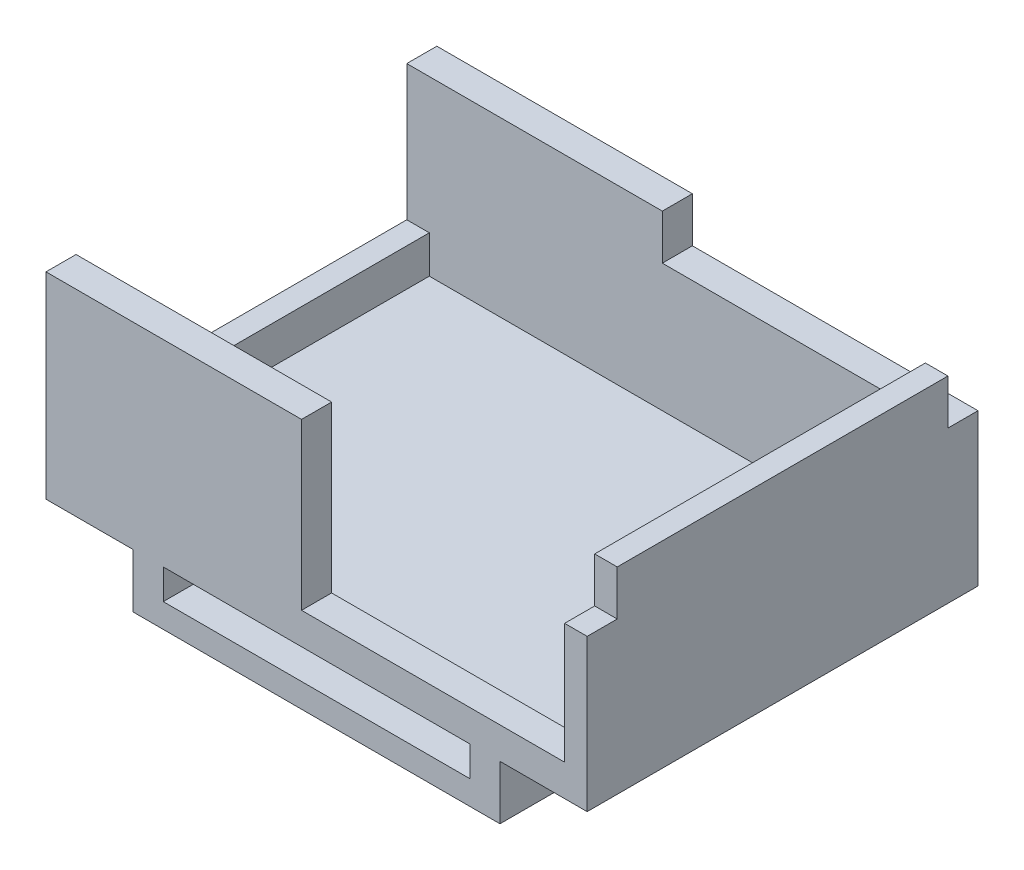
ISO-10303-21;
HEADER;
FILE_DESCRIPTION(('STEP AP214'),'2;1');
FILE_NAME('part.step','',(''),(''),'','','');
FILE_SCHEMA(('AUTOMOTIVE_DESIGN { 1 0 10303 214 1 1 1 1 }'));
ENDSEC;
DATA;
#1=APPLICATION_CONTEXT('core data for automotive mechanical design processes');
#2=APPLICATION_PROTOCOL_DEFINITION('international standard','automotive_design',2000,#1);
#3=PRODUCT_CONTEXT('',#1,'mechanical');
#4=PRODUCT('Part','Part','',(#3));
#5=PRODUCT_RELATED_PRODUCT_CATEGORY('part','',(#4));
#6=PRODUCT_DEFINITION_FORMATION('','',#4);
#7=PRODUCT_DEFINITION_CONTEXT('part definition',#1,'design');
#8=PRODUCT_DEFINITION('design','',#6,#7);
#9=PRODUCT_DEFINITION_SHAPE('','',#8);
#10=(LENGTH_UNIT() NAMED_UNIT(*) SI_UNIT(.MILLI.,.METRE.));
#11=(NAMED_UNIT(*) PLANE_ANGLE_UNIT() SI_UNIT($,.RADIAN.));
#12=(NAMED_UNIT(*) SI_UNIT($,.STERADIAN.) SOLID_ANGLE_UNIT());
#13=UNCERTAINTY_MEASURE_WITH_UNIT(LENGTH_MEASURE(1.E-05),#10,'distance_accuracy_value','');
#14=(GEOMETRIC_REPRESENTATION_CONTEXT(3) GLOBAL_UNCERTAINTY_ASSIGNED_CONTEXT((#13)) GLOBAL_UNIT_ASSIGNED_CONTEXT((#10,
#11,#12)) REPRESENTATION_CONTEXT('',''));
#15=CARTESIAN_POINT('',(0.,0.,0.));
#16=DIRECTION('',(0.,0.,1.));
#17=DIRECTION('',(1.,0.,0.));
#18=AXIS2_PLACEMENT_3D('',#15,#16,#17);
#19=CARTESIAN_POINT('',(0.,10.1,0.));
#20=DIRECTION('',(0.,1.,0.));
#21=DIRECTION('',(0.,0.,1.));
#22=AXIS2_PLACEMENT_3D('',#19,#20,#21);
#23=PLANE('',#22);
#24=DIRECTION('',(0.,0.,-1.));
#25=VECTOR('',#24,1.);
#26=CARTESIAN_POINT('',(16.5,10.1,13.));
#27=LINE('',#26,#25);
#28=CARTESIAN_POINT('',(16.5,10.1,13.));
#29=VERTEX_POINT('',#28);
#30=CARTESIAN_POINT('',(16.5,10.1,11.));
#31=VERTEX_POINT('',#30);
#32=EDGE_CURVE('E284',#29,#31,#27,.T.);
#33=ORIENTED_EDGE('',*,*,#32,.F.);
#34=DIRECTION('',(1.,0.,0.));
#35=VECTOR('',#34,1.);
#36=CARTESIAN_POINT('',(-18.,10.1,13.));
#37=LINE('',#36,#35);
#38=CARTESIAN_POINT('',(18.,10.1,13.));
#39=VERTEX_POINT('',#38);
#40=EDGE_CURVE('E482',#29,#39,#37,.T.);
#41=ORIENTED_EDGE('',*,*,#40,.T.);
#42=DIRECTION('',(0.,0.,-1.));
#43=VECTOR('',#42,1.);
#44=CARTESIAN_POINT('',(18.,10.1,-13.));
#45=LINE('',#44,#43);
#46=CARTESIAN_POINT('',(18.,10.1,11.));
#47=VERTEX_POINT('',#46);
#48=EDGE_CURVE('E61',#39,#47,#45,.T.);
#49=ORIENTED_EDGE('',*,*,#48,.T.);
#50=DIRECTION('',(1.,0.,0.));
#51=VECTOR('',#50,1.);
#52=CARTESIAN_POINT('',(16.5,10.1,11.));
#53=LINE('',#52,#51);
#54=EDGE_CURVE('E297',#31,#47,#53,.T.);
#55=ORIENTED_EDGE('',*,*,#54,.F.);
#56=EDGE_LOOP('',(#33,#41,#49,#55));
#57=FACE_BOUND('',#56,.T.);
#58=ADVANCED_FACE('F39',(#57),#23,.T.);
#59=DIRECTION('',(1.,0.,0.));
#60=VECTOR('',#59,1.);
#61=CARTESIAN_POINT('',(-16.5,10.1,-11.));
#62=LINE('',#61,#60);
#63=CARTESIAN_POINT('',(-0.999999999999997,10.1,-11.));
#64=VERTEX_POINT('',#63);
#65=CARTESIAN_POINT('',(16.5,10.1,-11.));
#66=VERTEX_POINT('',#65);
#67=EDGE_CURVE('E11',#64,#66,#62,.T.);
#68=ORIENTED_EDGE('',*,*,#67,.T.);
#69=DIRECTION('',(-1.,0.,0.));
#70=VECTOR('',#69,1.);
#71=CARTESIAN_POINT('',(16.5,10.1,-11.));
#72=LINE('',#71,#70);
#73=CARTESIAN_POINT('',(18.,10.1,-11.));
#74=VERTEX_POINT('',#73);
#75=EDGE_CURVE('E53',#74,#66,#72,.T.);
#76=ORIENTED_EDGE('',*,*,#75,.F.);
#77=CARTESIAN_POINT('',(18.,10.1,-13.));
#78=VERTEX_POINT('',#77);
#79=EDGE_CURVE('E485',#74,#78,#45,.T.);
#80=ORIENTED_EDGE('',*,*,#79,.T.);
#81=DIRECTION('',(-1.,0.,0.));
#82=VECTOR('',#81,1.);
#83=CARTESIAN_POINT('',(-18.,10.1,-13.));
#84=LINE('',#83,#82);
#85=CARTESIAN_POINT('',(-0.999999999999997,10.1,-13.));
#86=VERTEX_POINT('',#85);
#87=EDGE_CURVE('E487',#78,#86,#84,.T.);
#88=ORIENTED_EDGE('',*,*,#87,.T.);
#89=DIRECTION('',(0.,0.,-1.));
#90=VECTOR('',#89,1.);
#91=CARTESIAN_POINT('',(-0.999999999999997,10.1,-13.));
#92=LINE('',#91,#90);
#93=EDGE_CURVE('E274',#64,#86,#92,.T.);
#94=ORIENTED_EDGE('',*,*,#93,.F.);
#95=EDGE_LOOP('',(#68,#76,#80,#88,#94));
#96=FACE_BOUND('',#95,.T.);
#97=ADVANCED_FACE('F592',(#96),#23,.T.);
#98=CARTESIAN_POINT('',(0.,0.,0.));
#99=DIRECTION('',(0.,1.,0.));
#100=DIRECTION('',(0.,0.,1.));
#101=AXIS2_PLACEMENT_3D('',#98,#99,#100);
#102=PLANE('',#101);
#103=DIRECTION('',(0.,0.,1.));
#104=VECTOR('',#103,1.);
#105=CARTESIAN_POINT('',(-10.2,0.,-13.));
#106=LINE('',#105,#104);
#107=CARTESIAN_POINT('',(-10.2,0.,-13.));
#108=VERTEX_POINT('',#107);
#109=CARTESIAN_POINT('',(-10.2,0.,-9.));
#110=VERTEX_POINT('',#109);
#111=EDGE_CURVE('E381',#108,#110,#106,.T.);
#112=ORIENTED_EDGE('',*,*,#111,.F.);
#113=DIRECTION('',(-1.,0.,0.));
#114=VECTOR('',#113,1.);
#115=CARTESIAN_POINT('',(-18.,0.,-13.));
#116=LINE('',#115,#114);
#117=CARTESIAN_POINT('',(10.2,0.,-13.));
#118=VERTEX_POINT('',#117);
#119=EDGE_CURVE('E521',#118,#108,#116,.T.);
#120=ORIENTED_EDGE('',*,*,#119,.F.);
#121=DIRECTION('',(0.,0.,-1.));
#122=VECTOR('',#121,1.);
#123=CARTESIAN_POINT('',(10.2,0.,-13.));
#124=LINE('',#123,#122);
#125=CARTESIAN_POINT('',(10.2,0.,-8.99999999999999));
#126=VERTEX_POINT('',#125);
#127=EDGE_CURVE('E410',#126,#118,#124,.T.);
#128=ORIENTED_EDGE('',*,*,#127,.F.);
#129=DIRECTION('',(-1.,0.,0.));
#130=VECTOR('',#129,1.);
#131=CARTESIAN_POINT('',(10.2,0.,-8.99999999999999));
#132=LINE('',#131,#130);
#133=CARTESIAN_POINT('',(12.2,0.,-8.99999999999999));
#134=VERTEX_POINT('',#133);
#135=EDGE_CURVE('E412',#134,#126,#132,.T.);
#136=ORIENTED_EDGE('',*,*,#135,.F.);
#137=DIRECTION('',(0.,0.,1.));
#138=VECTOR('',#137,1.);
#139=CARTESIAN_POINT('',(12.2,0.,-13.));
#140=LINE('',#139,#138);
#141=CARTESIAN_POINT('',(12.2,0.,-13.));
#142=VERTEX_POINT('',#141);
#143=EDGE_CURVE('E405',#142,#134,#140,.T.);
#144=ORIENTED_EDGE('',*,*,#143,.F.);
#145=CARTESIAN_POINT('',(18.,0.,-13.));
#146=VERTEX_POINT('',#145);
#147=EDGE_CURVE('E517',#146,#142,#116,.T.);
#148=ORIENTED_EDGE('',*,*,#147,.F.);
#149=DIRECTION('',(0.,0.,-1.));
#150=VECTOR('',#149,1.);
#151=CARTESIAN_POINT('',(18.,0.,-13.));
#152=LINE('',#151,#150);
#153=CARTESIAN_POINT('',(18.,0.,13.));
#154=VERTEX_POINT('',#153);
#155=EDGE_CURVE('E505',#154,#146,#152,.T.);
#156=ORIENTED_EDGE('',*,*,#155,.F.);
#157=DIRECTION('',(1.,0.,0.));
#158=VECTOR('',#157,1.);
#159=CARTESIAN_POINT('',(-18.,0.,13.));
#160=LINE('',#159,#158);
#161=CARTESIAN_POINT('',(12.2,0.,13.));
#162=VERTEX_POINT('',#161);
#163=EDGE_CURVE('E524',#162,#154,#160,.T.);
#164=ORIENTED_EDGE('',*,*,#163,.F.);
#165=DIRECTION('',(0.,0.,1.));
#166=VECTOR('',#165,1.);
#167=CARTESIAN_POINT('',(12.2,0.,13.));
#168=LINE('',#167,#166);
#169=CARTESIAN_POINT('',(12.2,0.,8.99999999999999));
#170=VERTEX_POINT('',#169);
#171=EDGE_CURVE('E430',#170,#162,#168,.T.);
#172=ORIENTED_EDGE('',*,*,#171,.F.);
#173=DIRECTION('',(1.,0.,0.));
#174=VECTOR('',#173,1.);
#175=CARTESIAN_POINT('',(10.2,0.,8.99999999999999));
#176=LINE('',#175,#174);
#177=CARTESIAN_POINT('',(10.2,0.,8.99999999999999));
#178=VERTEX_POINT('',#177);
#179=EDGE_CURVE('E433',#178,#170,#176,.T.);
#180=ORIENTED_EDGE('',*,*,#179,.F.);
#181=DIRECTION('',(0.,0.,-1.));
#182=VECTOR('',#181,1.);
#183=CARTESIAN_POINT('',(10.2,0.,13.));
#184=LINE('',#183,#182);
#185=CARTESIAN_POINT('',(10.2,0.,13.));
#186=VERTEX_POINT('',#185);
#187=EDGE_CURVE('E425',#186,#178,#184,.T.);
#188=ORIENTED_EDGE('',*,*,#187,.F.);
#189=CARTESIAN_POINT('',(-10.2,0.,13.));
#190=VERTEX_POINT('',#189);
#191=EDGE_CURVE('E529',#190,#186,#160,.T.);
#192=ORIENTED_EDGE('',*,*,#191,.F.);
#193=DIRECTION('',(0.,0.,1.));
#194=VECTOR('',#193,1.);
#195=CARTESIAN_POINT('',(-10.2,0.,13.));
#196=LINE('',#195,#194);
#197=CARTESIAN_POINT('',(-10.2,0.,9.));
#198=VERTEX_POINT('',#197);
#199=EDGE_CURVE('E450',#198,#190,#196,.T.);
#200=ORIENTED_EDGE('',*,*,#199,.F.);
#201=DIRECTION('',(1.,0.,0.));
#202=VECTOR('',#201,1.);
#203=CARTESIAN_POINT('',(-10.2,0.,9.));
#204=LINE('',#203,#202);
#205=CARTESIAN_POINT('',(-12.2,0.,9.));
#206=VERTEX_POINT('',#205);
#207=EDGE_CURVE('E453',#206,#198,#204,.T.);
#208=ORIENTED_EDGE('',*,*,#207,.F.);
#209=DIRECTION('',(0.,0.,-1.));
#210=VECTOR('',#209,1.);
#211=CARTESIAN_POINT('',(-12.2,0.,13.));
#212=LINE('',#211,#210);
#213=CARTESIAN_POINT('',(-12.2,0.,13.));
#214=VERTEX_POINT('',#213);
#215=EDGE_CURVE('E445',#214,#206,#212,.T.);
#216=ORIENTED_EDGE('',*,*,#215,.F.);
#217=CARTESIAN_POINT('',(-18.,0.,13.));
#218=VERTEX_POINT('',#217);
#219=EDGE_CURVE('E525',#218,#214,#160,.T.);
#220=ORIENTED_EDGE('',*,*,#219,.F.);
#221=DIRECTION('',(0.,0.,1.));
#222=VECTOR('',#221,1.);
#223=CARTESIAN_POINT('',(-18.,0.,-13.));
#224=LINE('',#223,#222);
#225=CARTESIAN_POINT('',(-18.,0.,-13.));
#226=VERTEX_POINT('',#225);
#227=EDGE_CURVE('E520',#226,#218,#224,.T.);
#228=ORIENTED_EDGE('',*,*,#227,.F.);
#229=CARTESIAN_POINT('',(-12.2,0.,-13.));
#230=VERTEX_POINT('',#229);
#231=EDGE_CURVE('E516',#230,#226,#116,.T.);
#232=ORIENTED_EDGE('',*,*,#231,.F.);
#233=DIRECTION('',(0.,0.,-1.));
#234=VECTOR('',#233,1.);
#235=CARTESIAN_POINT('',(-12.2,0.,-13.));
#236=LINE('',#235,#234);
#237=CARTESIAN_POINT('',(-12.2,0.,-9.));
#238=VERTEX_POINT('',#237);
#239=EDGE_CURVE('E390',#238,#230,#236,.T.);
#240=ORIENTED_EDGE('',*,*,#239,.F.);
#241=DIRECTION('',(-1.,0.,0.));
#242=VECTOR('',#241,1.);
#243=CARTESIAN_POINT('',(-10.2,0.,-9.));
#244=LINE('',#243,#242);
#245=EDGE_CURVE('E393',#110,#238,#244,.T.);
#246=ORIENTED_EDGE('',*,*,#245,.F.);
#247=EDGE_LOOP('',(#112,#120,#128,#136,#144,#148,#156,#164,#172,#180,#188,#192,#200,#208,#216,
#220,#228,#232,#240,#246));
#248=FACE_BOUND('',#247,.T.);
#249=ADVANCED_FACE('F547',(#248),#102,.F.);
#250=CARTESIAN_POINT('',(18.,14.6,-13.));
#251=DIRECTION('',(-1.,0.,0.));
#252=DIRECTION('',(0.,0.,1.));
#253=AXIS2_PLACEMENT_3D('',#250,#251,#252);
#254=PLANE('',#253);
#255=ORIENTED_EDGE('',*,*,#48,.F.);
#256=DIRECTION('',(0.,-1.,0.));
#257=VECTOR('',#256,1.);
#258=CARTESIAN_POINT('',(18.,14.6,13.));
#259=LINE('',#258,#257);
#260=EDGE_CURVE('E528',#39,#154,#259,.T.);
#261=ORIENTED_EDGE('',*,*,#260,.T.);
#262=ORIENTED_EDGE('',*,*,#155,.T.);
#263=DIRECTION('',(0.,-1.,0.));
#264=VECTOR('',#263,1.);
#265=CARTESIAN_POINT('',(18.,14.6,-13.));
#266=LINE('',#265,#264);
#267=EDGE_CURVE('E47',#78,#146,#266,.T.);
#268=ORIENTED_EDGE('',*,*,#267,.F.);
#269=ORIENTED_EDGE('',*,*,#79,.F.);
#270=DIRECTION('',(0.,-1.,0.));
#271=VECTOR('',#270,1.);
#272=CARTESIAN_POINT('',(18.,13.1,-11.));
#273=LINE('',#272,#271);
#274=CARTESIAN_POINT('',(18.,13.1,-11.));
#275=VERTEX_POINT('',#274);
#276=EDGE_CURVE('E312',#275,#74,#273,.T.);
#277=ORIENTED_EDGE('',*,*,#276,.F.);
#278=DIRECTION('',(0.,0.,-1.));
#279=VECTOR('',#278,1.);
#280=CARTESIAN_POINT('',(18.,13.1,11.));
#281=LINE('',#280,#279);
#282=CARTESIAN_POINT('',(18.,13.1,11.));
#283=VERTEX_POINT('',#282);
#284=EDGE_CURVE('E303',#283,#275,#281,.T.);
#285=ORIENTED_EDGE('',*,*,#284,.F.);
#286=DIRECTION('',(0.,-1.,0.));
#287=VECTOR('',#286,1.);
#288=CARTESIAN_POINT('',(18.,13.1,11.));
#289=LINE('',#288,#287);
#290=EDGE_CURVE('E315',#283,#47,#289,.T.);
#291=ORIENTED_EDGE('',*,*,#290,.T.);
#292=EDGE_LOOP('',(#255,#261,#262,#268,#269,#277,#285,#291));
#293=FACE_BOUND('',#292,.T.);
#294=ADVANCED_FACE('F41',(#293),#254,.F.);
#295=CARTESIAN_POINT('',(-18.,14.6,-13.));
#296=DIRECTION('',(0.,0.,1.));
#297=DIRECTION('',(1.,0.,0.));
#298=AXIS2_PLACEMENT_3D('',#295,#296,#297);
#299=PLANE('',#298);
#300=DIRECTION('',(0.,1.,0.));
#301=VECTOR('',#300,1.);
#302=CARTESIAN_POINT('',(12.2,-2.,-13.));
#303=LINE('',#302,#301);
#304=CARTESIAN_POINT('',(12.2,-3.6,-13.));
#305=VERTEX_POINT('',#304);
#306=EDGE_CURVE('E423',#305,#142,#303,.T.);
#307=ORIENTED_EDGE('',*,*,#306,.F.);
#308=DIRECTION('',(1.,0.,0.));
#309=VECTOR('',#308,1.);
#310=CARTESIAN_POINT('',(-12.2,-3.6,-13.));
#311=LINE('',#310,#309);
#312=CARTESIAN_POINT('',(-12.2,-3.6,-13.));
#313=VERTEX_POINT('',#312);
#314=EDGE_CURVE('E353',#313,#305,#311,.T.);
#315=ORIENTED_EDGE('',*,*,#314,.F.);
#316=DIRECTION('',(0.,1.,0.));
#317=VECTOR('',#316,1.);
#318=CARTESIAN_POINT('',(-12.2,-2.,-13.));
#319=LINE('',#318,#317);
#320=EDGE_CURVE('E398',#313,#230,#319,.T.);
#321=ORIENTED_EDGE('',*,*,#320,.T.);
#322=ORIENTED_EDGE('',*,*,#231,.T.);
#323=DIRECTION('',(0.,-1.,0.));
#324=VECTOR('',#323,1.);
#325=CARTESIAN_POINT('',(-18.,14.6,-13.));
#326=LINE('',#325,#324);
#327=CARTESIAN_POINT('',(-18.,13.1,-13.));
#328=VERTEX_POINT('',#327);
#329=EDGE_CURVE('E534',#328,#226,#326,.T.);
#330=ORIENTED_EDGE('',*,*,#329,.F.);
#331=DIRECTION('',(-1.,0.,0.));
#332=VECTOR('',#331,1.);
#333=CARTESIAN_POINT('',(-18.,13.1,-13.));
#334=LINE('',#333,#332);
#335=CARTESIAN_POINT('',(-0.999999999999997,13.1,-13.));
#336=VERTEX_POINT('',#335);
#337=EDGE_CURVE('E338',#336,#328,#334,.T.);
#338=ORIENTED_EDGE('',*,*,#337,.F.);
#339=DIRECTION('',(0.,-1.,0.));
#340=VECTOR('',#339,1.);
#341=CARTESIAN_POINT('',(-0.999999999999997,13.1,-13.));
#342=LINE('',#341,#340);
#343=EDGE_CURVE('E341',#336,#86,#342,.T.);
#344=ORIENTED_EDGE('',*,*,#343,.T.);
#345=ORIENTED_EDGE('',*,*,#87,.F.);
#346=ORIENTED_EDGE('',*,*,#267,.T.);
#347=ORIENTED_EDGE('',*,*,#147,.T.);
#348=EDGE_LOOP('',(#307,#315,#321,#322,#330,#338,#344,#345,#346,#347));
#349=FACE_BOUND('',#348,.T.);
#350=DIRECTION('',(1.,0.,0.));
#351=VECTOR('',#350,1.);
#352=CARTESIAN_POINT('',(-12.2,-2.,-13.));
#353=LINE('',#352,#351);
#354=CARTESIAN_POINT('',(-10.2,-2.,-13.));
#355=VERTEX_POINT('',#354);
#356=CARTESIAN_POINT('',(10.2,-2.,-13.));
#357=VERTEX_POINT('',#356);
#358=EDGE_CURVE('E349',#355,#357,#353,.T.);
#359=ORIENTED_EDGE('',*,*,#358,.T.);
#360=DIRECTION('',(0.,1.,0.));
#361=VECTOR('',#360,1.);
#362=CARTESIAN_POINT('',(10.2,-2.,-13.));
#363=LINE('',#362,#361);
#364=EDGE_CURVE('E409',#357,#118,#363,.T.);
#365=ORIENTED_EDGE('',*,*,#364,.T.);
#366=ORIENTED_EDGE('',*,*,#119,.T.);
#367=DIRECTION('',(0.,1.,0.));
#368=VECTOR('',#367,1.);
#369=CARTESIAN_POINT('',(-10.2,-2.,-13.));
#370=LINE('',#369,#368);
#371=EDGE_CURVE('E389',#355,#108,#370,.T.);
#372=ORIENTED_EDGE('',*,*,#371,.F.);
#373=EDGE_LOOP('',(#359,#365,#366,#372));
#374=FACE_BOUND('',#373,.T.);
#375=ADVANCED_FACE('F540',(#349,#374),#299,.F.);
#376=CARTESIAN_POINT('',(-18.,14.6,-13.));
#377=DIRECTION('',(1.,0.,0.));
#378=DIRECTION('',(0.,0.,-1.));
#379=AXIS2_PLACEMENT_3D('',#376,#377,#378);
#380=PLANE('',#379);
#381=DIRECTION('',(0.,-1.,0.));
#382=VECTOR('',#381,1.);
#383=CARTESIAN_POINT('',(-18.,14.6,13.));
#384=LINE('',#383,#382);
#385=CARTESIAN_POINT('',(-18.,13.1,13.));
#386=VERTEX_POINT('',#385);
#387=EDGE_CURVE('E532',#386,#218,#384,.T.);
#388=ORIENTED_EDGE('',*,*,#387,.F.);
#389=DIRECTION('',(0.,0.,1.));
#390=VECTOR('',#389,1.);
#391=CARTESIAN_POINT('',(-18.,13.1,11.));
#392=LINE('',#391,#390);
#393=CARTESIAN_POINT('',(-18.,13.1,11.));
#394=VERTEX_POINT('',#393);
#395=EDGE_CURVE('E321',#394,#386,#392,.T.);
#396=ORIENTED_EDGE('',*,*,#395,.F.);
#397=DIRECTION('',(0.,1.,0.));
#398=VECTOR('',#397,1.);
#399=CARTESIAN_POINT('',(-18.,4.1,11.));
#400=LINE('',#399,#398);
#401=CARTESIAN_POINT('',(-18.,4.1,11.));
#402=VERTEX_POINT('',#401);
#403=EDGE_CURVE('E480',#402,#394,#400,.T.);
#404=ORIENTED_EDGE('',*,*,#403,.F.);
#405=DIRECTION('',(0.,0.,1.));
#406=VECTOR('',#405,1.);
#407=CARTESIAN_POINT('',(-18.,4.1,-11.));
#408=LINE('',#407,#406);
#409=CARTESIAN_POINT('',(-18.,4.1,-11.));
#410=VERTEX_POINT('',#409);
#411=EDGE_CURVE('E475',#410,#402,#408,.T.);
#412=ORIENTED_EDGE('',*,*,#411,.F.);
#413=DIRECTION('',(0.,1.,0.));
#414=VECTOR('',#413,1.);
#415=CARTESIAN_POINT('',(-18.,4.1,-11.));
#416=LINE('',#415,#414);
#417=CARTESIAN_POINT('',(-18.,13.1,-11.));
#418=VERTEX_POINT('',#417);
#419=EDGE_CURVE('E479',#410,#418,#416,.T.);
#420=ORIENTED_EDGE('',*,*,#419,.T.);
#421=DIRECTION('',(0.,0.,1.));
#422=VECTOR('',#421,1.);
#423=CARTESIAN_POINT('',(-18.,13.1,-13.));
#424=LINE('',#423,#422);
#425=EDGE_CURVE('E331',#328,#418,#424,.T.);
#426=ORIENTED_EDGE('',*,*,#425,.F.);
#427=ORIENTED_EDGE('',*,*,#329,.T.);
#428=ORIENTED_EDGE('',*,*,#227,.T.);
#429=EDGE_LOOP('',(#388,#396,#404,#412,#420,#426,#427,#428));
#430=FACE_BOUND('',#429,.T.);
#431=ADVANCED_FACE('F627',(#430),#380,.F.);
#432=CARTESIAN_POINT('',(-18.,14.6,13.));
#433=DIRECTION('',(0.,0.,-1.));
#434=DIRECTION('',(-1.,0.,0.));
#435=AXIS2_PLACEMENT_3D('',#432,#433,#434);
#436=PLANE('',#435);
#437=DIRECTION('',(1.,0.,0.));
#438=VECTOR('',#437,1.);
#439=CARTESIAN_POINT('',(-0.999999999999997,2.1,13.));
#440=LINE('',#439,#438);
#441=CARTESIAN_POINT('',(-0.999999999999997,2.1,13.));
#442=VERTEX_POINT('',#441);
#443=CARTESIAN_POINT('',(16.5,2.1,13.));
#444=VERTEX_POINT('',#443);
#445=EDGE_CURVE('E280',#442,#444,#440,.T.);
#446=ORIENTED_EDGE('',*,*,#445,.F.);
#447=DIRECTION('',(0.,-1.,0.));
#448=VECTOR('',#447,1.);
#449=CARTESIAN_POINT('',(-0.999999999999997,13.1,13.));
#450=LINE('',#449,#448);
#451=CARTESIAN_POINT('',(-0.999999999999997,13.1,13.));
#452=VERTEX_POINT('',#451);
#453=EDGE_CURVE('E264',#452,#442,#450,.T.);
#454=ORIENTED_EDGE('',*,*,#453,.F.);
#455=DIRECTION('',(1.,0.,0.));
#456=VECTOR('',#455,1.);
#457=CARTESIAN_POINT('',(-18.,13.1,13.));
#458=LINE('',#457,#456);
#459=EDGE_CURVE('E324',#386,#452,#458,.T.);
#460=ORIENTED_EDGE('',*,*,#459,.F.);
#461=ORIENTED_EDGE('',*,*,#387,.T.);
#462=ORIENTED_EDGE('',*,*,#219,.T.);
#463=DIRECTION('',(0.,1.,0.));
#464=VECTOR('',#463,1.);
#465=CARTESIAN_POINT('',(-12.2,-2.,13.));
#466=LINE('',#465,#464);
#467=CARTESIAN_POINT('',(-12.2,-3.6,13.));
#468=VERTEX_POINT('',#467);
#469=EDGE_CURVE('E449',#468,#214,#466,.T.);
#470=ORIENTED_EDGE('',*,*,#469,.F.);
#471=DIRECTION('',(-1.,0.,0.));
#472=VECTOR('',#471,1.);
#473=CARTESIAN_POINT('',(-12.2,-3.6,13.));
#474=LINE('',#473,#472);
#475=CARTESIAN_POINT('',(12.2,-3.6,13.));
#476=VERTEX_POINT('',#475);
#477=EDGE_CURVE('E378',#476,#468,#474,.T.);
#478=ORIENTED_EDGE('',*,*,#477,.F.);
#479=DIRECTION('',(0.,1.,0.));
#480=VECTOR('',#479,1.);
#481=CARTESIAN_POINT('',(12.2,-2.,13.));
#482=LINE('',#481,#480);
#483=EDGE_CURVE('E438',#476,#162,#482,.T.);
#484=ORIENTED_EDGE('',*,*,#483,.T.);
#485=ORIENTED_EDGE('',*,*,#163,.T.);
#486=ORIENTED_EDGE('',*,*,#260,.F.);
#487=ORIENTED_EDGE('',*,*,#40,.F.);
#488=DIRECTION('',(0.,1.,0.));
#489=VECTOR('',#488,1.);
#490=CARTESIAN_POINT('',(16.5,2.1,13.));
#491=LINE('',#490,#489);
#492=EDGE_CURVE('E289',#444,#29,#491,.T.);
#493=ORIENTED_EDGE('',*,*,#492,.F.);
#494=EDGE_LOOP('',(#446,#454,#460,#461,#462,#470,#478,#484,#485,#486,#487,#493));
#495=FACE_BOUND('',#494,.T.);
#496=DIRECTION('',(-1.,0.,0.));
#497=VECTOR('',#496,1.);
#498=CARTESIAN_POINT('',(-12.2,-2.,13.));
#499=LINE('',#498,#497);
#500=CARTESIAN_POINT('',(10.2,-2.,13.));
#501=VERTEX_POINT('',#500);
#502=CARTESIAN_POINT('',(-10.2,-2.,13.));
#503=VERTEX_POINT('',#502);
#504=EDGE_CURVE('E372',#501,#503,#499,.T.);
#505=ORIENTED_EDGE('',*,*,#504,.T.);
#506=DIRECTION('',(0.,1.,0.));
#507=VECTOR('',#506,1.);
#508=CARTESIAN_POINT('',(-10.2,-2.,13.));
#509=LINE('',#508,#507);
#510=EDGE_CURVE('E460',#503,#190,#509,.T.);
#511=ORIENTED_EDGE('',*,*,#510,.T.);
#512=ORIENTED_EDGE('',*,*,#191,.T.);
#513=DIRECTION('',(0.,1.,0.));
#514=VECTOR('',#513,1.);
#515=CARTESIAN_POINT('',(10.2,-2.,13.));
#516=LINE('',#515,#514);
#517=EDGE_CURVE('E429',#501,#186,#516,.T.);
#518=ORIENTED_EDGE('',*,*,#517,.F.);
#519=EDGE_LOOP('',(#505,#511,#512,#518));
#520=FACE_BOUND('',#519,.T.);
#521=ADVANCED_FACE('F286',(#495,#520),#436,.F.);
#522=CARTESIAN_POINT('',(0.,1.6,0.));
#523=DIRECTION('',(0.,1.,0.));
#524=DIRECTION('',(0.,0.,1.));
#525=AXIS2_PLACEMENT_3D('',#522,#523,#524);
#526=PLANE('',#525);
#527=DIRECTION('',(0.,0.,-1.));
#528=VECTOR('',#527,1.);
#529=CARTESIAN_POINT('',(16.5,1.6,-11.));
#530=LINE('',#529,#528);
#531=CARTESIAN_POINT('',(16.5,1.6,11.));
#532=VERTEX_POINT('',#531);
#533=CARTESIAN_POINT('',(16.5,1.6,-11.));
#534=VERTEX_POINT('',#533);
#535=EDGE_CURVE('E489',#532,#534,#530,.T.);
#536=ORIENTED_EDGE('',*,*,#535,.T.);
#537=DIRECTION('',(-1.,0.,0.));
#538=VECTOR('',#537,1.);
#539=CARTESIAN_POINT('',(-16.5,1.6,-11.));
#540=LINE('',#539,#538);
#541=CARTESIAN_POINT('',(-16.5,1.6,-11.));
#542=VERTEX_POINT('',#541);
#543=EDGE_CURVE('E492',#534,#542,#540,.T.);
#544=ORIENTED_EDGE('',*,*,#543,.T.);
#545=DIRECTION('',(0.,0.,1.));
#546=VECTOR('',#545,1.);
#547=CARTESIAN_POINT('',(-16.5,1.6,-11.));
#548=LINE('',#547,#546);
#549=CARTESIAN_POINT('',(-16.5,1.6,11.));
#550=VERTEX_POINT('',#549);
#551=EDGE_CURVE('E495',#542,#550,#548,.T.);
#552=ORIENTED_EDGE('',*,*,#551,.T.);
#553=DIRECTION('',(1.,0.,0.));
#554=VECTOR('',#553,1.);
#555=CARTESIAN_POINT('',(-16.5,1.6,11.));
#556=LINE('',#555,#554);
#557=EDGE_CURVE('E498',#550,#532,#556,.T.);
#558=ORIENTED_EDGE('',*,*,#557,.T.);
#559=EDGE_LOOP('',(#536,#544,#552,#558));
#560=FACE_BOUND('',#559,.T.);
#561=ADVANCED_FACE('F604',(#560),#526,.T.);
#562=CARTESIAN_POINT('',(-16.5,1.6,-11.));
#563=DIRECTION('',(0.,0.,-1.));
#564=DIRECTION('',(-1.,0.,0.));
#565=AXIS2_PLACEMENT_3D('',#562,#563,#564);
#566=PLANE('',#565);
#567=ORIENTED_EDGE('',*,*,#67,.F.);
#568=DIRECTION('',(0.,-1.,0.));
#569=VECTOR('',#568,1.);
#570=CARTESIAN_POINT('',(-0.999999999999997,13.1,-11.));
#571=LINE('',#570,#569);
#572=CARTESIAN_POINT('',(-0.999999999999997,13.1,-11.));
#573=VERTEX_POINT('',#572);
#574=EDGE_CURVE('E346',#573,#64,#571,.T.);
#575=ORIENTED_EDGE('',*,*,#574,.F.);
#576=DIRECTION('',(1.,0.,0.));
#577=VECTOR('',#576,1.);
#578=CARTESIAN_POINT('',(-18.,13.1,-11.));
#579=LINE('',#578,#577);
#580=EDGE_CURVE('E334',#418,#573,#579,.T.);
#581=ORIENTED_EDGE('',*,*,#580,.F.);
#582=ORIENTED_EDGE('',*,*,#419,.F.);
#583=DIRECTION('',(-1.,0.,0.));
#584=VECTOR('',#583,1.);
#585=CARTESIAN_POINT('',(-16.5,4.1,-11.));
#586=LINE('',#585,#584);
#587=CARTESIAN_POINT('',(-16.5,4.1,-11.));
#588=VERTEX_POINT('',#587);
#589=EDGE_CURVE('E472',#588,#410,#586,.T.);
#590=ORIENTED_EDGE('',*,*,#589,.F.);
#591=DIRECTION('',(0.,1.,0.));
#592=VECTOR('',#591,1.);
#593=CARTESIAN_POINT('',(-16.5,1.6,-11.));
#594=LINE('',#593,#592);
#595=EDGE_CURVE('E509',#542,#588,#594,.T.);
#596=ORIENTED_EDGE('',*,*,#595,.F.);
#597=ORIENTED_EDGE('',*,*,#543,.F.);
#598=DIRECTION('',(0.,1.,0.));
#599=VECTOR('',#598,1.);
#600=CARTESIAN_POINT('',(16.5,1.6,-11.));
#601=LINE('',#600,#599);
#602=EDGE_CURVE('E501',#534,#66,#601,.T.);
#603=ORIENTED_EDGE('',*,*,#602,.T.);
#604=EDGE_LOOP('',(#567,#575,#581,#582,#590,#596,#597,#603));
#605=FACE_BOUND('',#604,.T.);
#606=ADVANCED_FACE('F607',(#605),#566,.F.);
#607=CARTESIAN_POINT('',(-16.5,1.6,-11.));
#608=DIRECTION('',(-1.,0.,0.));
#609=DIRECTION('',(0.,0.,1.));
#610=AXIS2_PLACEMENT_3D('',#607,#608,#609);
#611=PLANE('',#610);
#612=ORIENTED_EDGE('',*,*,#595,.T.);
#613=DIRECTION('',(0.,0.,-1.));
#614=VECTOR('',#613,1.);
#615=CARTESIAN_POINT('',(-16.5,4.1,-11.));
#616=LINE('',#615,#614);
#617=CARTESIAN_POINT('',(-16.5,4.1,11.));
#618=VERTEX_POINT('',#617);
#619=EDGE_CURVE('E469',#618,#588,#616,.T.);
#620=ORIENTED_EDGE('',*,*,#619,.F.);
#621=DIRECTION('',(0.,1.,0.));
#622=VECTOR('',#621,1.);
#623=CARTESIAN_POINT('',(-16.5,1.6,11.));
#624=LINE('',#623,#622);
#625=EDGE_CURVE('E506',#550,#618,#624,.T.);
#626=ORIENTED_EDGE('',*,*,#625,.F.);
#627=ORIENTED_EDGE('',*,*,#551,.F.);
#628=EDGE_LOOP('',(#612,#620,#626,#627));
#629=FACE_BOUND('',#628,.T.);
#630=ADVANCED_FACE('F613',(#629),#611,.F.);
#631=CARTESIAN_POINT('',(-16.5,1.6,11.));
#632=DIRECTION('',(0.,0.,1.));
#633=DIRECTION('',(1.,0.,0.));
#634=AXIS2_PLACEMENT_3D('',#631,#632,#633);
#635=PLANE('',#634);
#636=DIRECTION('',(0.,-1.,0.));
#637=VECTOR('',#636,1.);
#638=CARTESIAN_POINT('',(-0.999999999999997,13.1,11.));
#639=LINE('',#638,#637);
#640=CARTESIAN_POINT('',(-0.999999999999997,13.1,11.));
#641=VERTEX_POINT('',#640);
#642=CARTESIAN_POINT('',(-0.999999999999997,2.1,11.));
#643=VERTEX_POINT('',#642);
#644=EDGE_CURVE('E275',#641,#643,#639,.T.);
#645=ORIENTED_EDGE('',*,*,#644,.T.);
#646=DIRECTION('',(-1.,0.,0.));
#647=VECTOR('',#646,1.);
#648=CARTESIAN_POINT('',(-0.999999999999997,2.1,11.));
#649=LINE('',#648,#647);
#650=CARTESIAN_POINT('',(16.5,2.1,11.));
#651=VERTEX_POINT('',#650);
#652=EDGE_CURVE('E283',#651,#643,#649,.T.);
#653=ORIENTED_EDGE('',*,*,#652,.F.);
#654=DIRECTION('',(0.,1.,0.));
#655=VECTOR('',#654,1.);
#656=CARTESIAN_POINT('',(16.5,1.6,11.));
#657=LINE('',#656,#655);
#658=EDGE_CURVE('E502',#532,#651,#657,.T.);
#659=ORIENTED_EDGE('',*,*,#658,.F.);
#660=ORIENTED_EDGE('',*,*,#557,.F.);
#661=ORIENTED_EDGE('',*,*,#625,.T.);
#662=DIRECTION('',(1.,0.,0.));
#663=VECTOR('',#662,1.);
#664=CARTESIAN_POINT('',(-16.5,4.1,11.));
#665=LINE('',#664,#663);
#666=EDGE_CURVE('E477',#402,#618,#665,.T.);
#667=ORIENTED_EDGE('',*,*,#666,.F.);
#668=ORIENTED_EDGE('',*,*,#403,.T.);
#669=DIRECTION('',(-1.,0.,0.));
#670=VECTOR('',#669,1.);
#671=CARTESIAN_POINT('',(-18.,13.1,11.));
#672=LINE('',#671,#670);
#673=EDGE_CURVE('E327',#641,#394,#672,.T.);
#674=ORIENTED_EDGE('',*,*,#673,.F.);
#675=EDGE_LOOP('',(#645,#653,#659,#660,#661,#667,#668,#674));
#676=FACE_BOUND('',#675,.T.);
#677=ADVANCED_FACE('F609',(#676),#635,.F.);
#678=CARTESIAN_POINT('',(16.5,1.6,-11.));
#679=DIRECTION('',(1.,0.,0.));
#680=DIRECTION('',(0.,0.,-1.));
#681=AXIS2_PLACEMENT_3D('',#678,#679,#680);
#682=PLANE('',#681);
#683=ORIENTED_EDGE('',*,*,#658,.T.);
#684=DIRECTION('',(0.,0.,-1.));
#685=VECTOR('',#684,1.);
#686=CARTESIAN_POINT('',(16.5,2.1,13.));
#687=LINE('',#686,#685);
#688=EDGE_CURVE('E290',#444,#651,#687,.T.);
#689=ORIENTED_EDGE('',*,*,#688,.F.);
#690=ORIENTED_EDGE('',*,*,#492,.T.);
#691=ORIENTED_EDGE('',*,*,#32,.T.);
#692=DIRECTION('',(0.,-1.,0.));
#693=VECTOR('',#692,1.);
#694=CARTESIAN_POINT('',(16.5,13.1,11.));
#695=LINE('',#694,#693);
#696=CARTESIAN_POINT('',(16.5,13.1,11.));
#697=VERTEX_POINT('',#696);
#698=EDGE_CURVE('E318',#697,#31,#695,.T.);
#699=ORIENTED_EDGE('',*,*,#698,.F.);
#700=DIRECTION('',(0.,0.,1.));
#701=VECTOR('',#700,1.);
#702=CARTESIAN_POINT('',(16.5,13.1,11.));
#703=LINE('',#702,#701);
#704=CARTESIAN_POINT('',(16.5,13.1,-11.));
#705=VERTEX_POINT('',#704);
#706=EDGE_CURVE('E298',#705,#697,#703,.T.);
#707=ORIENTED_EDGE('',*,*,#706,.F.);
#708=DIRECTION('',(0.,-1.,0.));
#709=VECTOR('',#708,1.);
#710=CARTESIAN_POINT('',(16.5,13.1,-11.));
#711=LINE('',#710,#709);
#712=EDGE_CURVE('E307',#705,#66,#711,.T.);
#713=ORIENTED_EDGE('',*,*,#712,.T.);
#714=ORIENTED_EDGE('',*,*,#602,.F.);
#715=ORIENTED_EDGE('',*,*,#535,.F.);
#716=EDGE_LOOP('',(#683,#689,#690,#691,#699,#707,#713,#714,#715));
#717=FACE_BOUND('',#716,.T.);
#718=ADVANCED_FACE('F612',(#717),#682,.F.);
#719=CARTESIAN_POINT('',(0.,4.1,0.));
#720=DIRECTION('',(0.,-1.,0.));
#721=DIRECTION('',(0.,0.,-1.));
#722=AXIS2_PLACEMENT_3D('',#719,#720,#721);
#723=PLANE('',#722);
#724=ORIENTED_EDGE('',*,*,#619,.T.);
#725=ORIENTED_EDGE('',*,*,#589,.T.);
#726=ORIENTED_EDGE('',*,*,#411,.T.);
#727=ORIENTED_EDGE('',*,*,#666,.T.);
#728=EDGE_LOOP('',(#724,#725,#726,#727));
#729=FACE_BOUND('',#728,.T.);
#730=ADVANCED_FACE('F602',(#729),#723,.F.);
#731=CARTESIAN_POINT('',(-12.2,-2.,13.));
#732=DIRECTION('',(1.,0.,0.));
#733=DIRECTION('',(0.,0.,-1.));
#734=AXIS2_PLACEMENT_3D('',#731,#732,#733);
#735=PLANE('',#734);
#736=ORIENTED_EDGE('',*,*,#215,.T.);
#737=DIRECTION('',(0.,1.,0.));
#738=VECTOR('',#737,1.);
#739=CARTESIAN_POINT('',(-12.2,-2.,9.));
#740=LINE('',#739,#738);
#741=CARTESIAN_POINT('',(-12.2,-3.6,8.99999999999999));
#742=VERTEX_POINT('',#741);
#743=EDGE_CURVE('E466',#742,#206,#740,.T.);
#744=ORIENTED_EDGE('',*,*,#743,.F.);
#745=DIRECTION('',(0.,0.,-1.));
#746=VECTOR('',#745,1.);
#747=CARTESIAN_POINT('',(-12.2,-3.6,13.));
#748=LINE('',#747,#746);
#749=EDGE_CURVE('E368',#468,#742,#748,.T.);
#750=ORIENTED_EDGE('',*,*,#749,.F.);
#751=ORIENTED_EDGE('',*,*,#469,.T.);
#752=EDGE_LOOP('',(#736,#744,#750,#751));
#753=FACE_BOUND('',#752,.T.);
#754=ADVANCED_FACE('F569',(#753),#735,.F.);
#755=CARTESIAN_POINT('',(-10.2,-2.,9.));
#756=DIRECTION('',(0.,0.,1.));
#757=DIRECTION('',(1.,0.,0.));
#758=AXIS2_PLACEMENT_3D('',#755,#756,#757);
#759=PLANE('',#758);
#760=ORIENTED_EDGE('',*,*,#207,.T.);
#761=DIRECTION('',(0.,1.,0.));
#762=VECTOR('',#761,1.);
#763=CARTESIAN_POINT('',(-10.2,-2.,9.));
#764=LINE('',#763,#762);
#765=CARTESIAN_POINT('',(-10.2,-2.,9.));
#766=VERTEX_POINT('',#765);
#767=EDGE_CURVE('E463',#766,#198,#764,.T.);
#768=ORIENTED_EDGE('',*,*,#767,.F.);
#769=DIRECTION('',(1.,0.,0.));
#770=VECTOR('',#769,1.);
#771=CARTESIAN_POINT('',(-12.2,-2.,8.99999999999999));
#772=LINE('',#771,#770);
#773=CARTESIAN_POINT('',(10.2,-2.,8.99999999999999));
#774=VERTEX_POINT('',#773);
#775=EDGE_CURVE('E363',#766,#774,#772,.T.);
#776=ORIENTED_EDGE('',*,*,#775,.T.);
#777=DIRECTION('',(0.,1.,0.));
#778=VECTOR('',#777,1.);
#779=CARTESIAN_POINT('',(10.2,-2.,8.99999999999999));
#780=LINE('',#779,#778);
#781=EDGE_CURVE('E443',#774,#178,#780,.T.);
#782=ORIENTED_EDGE('',*,*,#781,.T.);
#783=ORIENTED_EDGE('',*,*,#179,.T.);
#784=DIRECTION('',(0.,1.,0.));
#785=VECTOR('',#784,1.);
#786=CARTESIAN_POINT('',(12.2,-2.,8.99999999999999));
#787=LINE('',#786,#785);
#788=CARTESIAN_POINT('',(12.2,-3.6,8.99999999999999));
#789=VERTEX_POINT('',#788);
#790=EDGE_CURVE('E440',#789,#170,#787,.T.);
#791=ORIENTED_EDGE('',*,*,#790,.F.);
#792=DIRECTION('',(1.,0.,0.));
#793=VECTOR('',#792,1.);
#794=CARTESIAN_POINT('',(-12.2,-3.6,8.99999999999999));
#795=LINE('',#794,#793);
#796=EDGE_CURVE('E371',#742,#789,#795,.T.);
#797=ORIENTED_EDGE('',*,*,#796,.F.);
#798=ORIENTED_EDGE('',*,*,#743,.T.);
#799=EDGE_LOOP('',(#760,#768,#776,#782,#783,#791,#797,#798));
#800=FACE_BOUND('',#799,.T.);
#801=ADVANCED_FACE('F563',(#800),#759,.F.);
#802=CARTESIAN_POINT('',(-10.2,-2.,13.));
#803=DIRECTION('',(-1.,0.,0.));
#804=DIRECTION('',(0.,0.,1.));
#805=AXIS2_PLACEMENT_3D('',#802,#803,#804);
#806=PLANE('',#805);
#807=ORIENTED_EDGE('',*,*,#199,.T.);
#808=ORIENTED_EDGE('',*,*,#510,.F.);
#809=DIRECTION('',(0.,0.,1.));
#810=VECTOR('',#809,1.);
#811=CARTESIAN_POINT('',(-10.2,-2.,13.));
#812=LINE('',#811,#810);
#813=EDGE_CURVE('E446',#766,#503,#812,.T.);
#814=ORIENTED_EDGE('',*,*,#813,.F.);
#815=ORIENTED_EDGE('',*,*,#767,.T.);
#816=EDGE_LOOP('',(#807,#808,#814,#815));
#817=FACE_BOUND('',#816,.T.);
#818=ADVANCED_FACE('F559',(#817),#806,.F.);
#819=CARTESIAN_POINT('',(10.2,-2.,13.));
#820=DIRECTION('',(1.,0.,0.));
#821=DIRECTION('',(0.,0.,-1.));
#822=AXIS2_PLACEMENT_3D('',#819,#820,#821);
#823=PLANE('',#822);
#824=ORIENTED_EDGE('',*,*,#187,.T.);
#825=ORIENTED_EDGE('',*,*,#781,.F.);
#826=DIRECTION('',(0.,0.,-1.));
#827=VECTOR('',#826,1.);
#828=CARTESIAN_POINT('',(10.2,-2.,13.));
#829=LINE('',#828,#827);
#830=EDGE_CURVE('E426',#501,#774,#829,.T.);
#831=ORIENTED_EDGE('',*,*,#830,.F.);
#832=ORIENTED_EDGE('',*,*,#517,.T.);
#833=EDGE_LOOP('',(#824,#825,#831,#832));
#834=FACE_BOUND('',#833,.T.);
#835=ADVANCED_FACE('F576',(#834),#823,.F.);
#836=CARTESIAN_POINT('',(12.2,-2.,13.));
#837=DIRECTION('',(-1.,0.,0.));
#838=DIRECTION('',(0.,0.,1.));
#839=AXIS2_PLACEMENT_3D('',#836,#837,#838);
#840=PLANE('',#839);
#841=ORIENTED_EDGE('',*,*,#171,.T.);
#842=ORIENTED_EDGE('',*,*,#483,.F.);
#843=DIRECTION('',(0.,0.,1.));
#844=VECTOR('',#843,1.);
#845=CARTESIAN_POINT('',(12.2,-3.6,13.));
#846=LINE('',#845,#844);
#847=EDGE_CURVE('E375',#789,#476,#846,.T.);
#848=ORIENTED_EDGE('',*,*,#847,.F.);
#849=ORIENTED_EDGE('',*,*,#790,.T.);
#850=EDGE_LOOP('',(#841,#842,#848,#849));
#851=FACE_BOUND('',#850,.T.);
#852=ADVANCED_FACE('F574',(#851),#840,.F.);
#853=CARTESIAN_POINT('',(12.2,-2.,-13.));
#854=DIRECTION('',(-1.,0.,0.));
#855=DIRECTION('',(0.,0.,1.));
#856=AXIS2_PLACEMENT_3D('',#853,#854,#855);
#857=PLANE('',#856);
#858=ORIENTED_EDGE('',*,*,#143,.T.);
#859=DIRECTION('',(0.,1.,0.));
#860=VECTOR('',#859,1.);
#861=CARTESIAN_POINT('',(12.2,-2.,-8.99999999999999));
#862=LINE('',#861,#860);
#863=CARTESIAN_POINT('',(12.2,-3.6,-9.));
#864=VERTEX_POINT('',#863);
#865=EDGE_CURVE('E420',#864,#134,#862,.T.);
#866=ORIENTED_EDGE('',*,*,#865,.F.);
#867=DIRECTION('',(0.,0.,1.));
#868=VECTOR('',#867,1.);
#869=CARTESIAN_POINT('',(12.2,-3.6,-9.));
#870=LINE('',#869,#868);
#871=EDGE_CURVE('E357',#305,#864,#870,.T.);
#872=ORIENTED_EDGE('',*,*,#871,.F.);
#873=ORIENTED_EDGE('',*,*,#306,.T.);
#874=EDGE_LOOP('',(#858,#866,#872,#873));
#875=FACE_BOUND('',#874,.T.);
#876=ADVANCED_FACE('F707',(#875),#857,.F.);
#877=CARTESIAN_POINT('',(10.2,-2.,-8.99999999999999));
#878=DIRECTION('',(0.,0.,-1.));
#879=DIRECTION('',(-1.,0.,0.));
#880=AXIS2_PLACEMENT_3D('',#877,#878,#879);
#881=PLANE('',#880);
#882=ORIENTED_EDGE('',*,*,#135,.T.);
#883=DIRECTION('',(0.,1.,0.));
#884=VECTOR('',#883,1.);
#885=CARTESIAN_POINT('',(10.2,-2.,-8.99999999999999));
#886=LINE('',#885,#884);
#887=CARTESIAN_POINT('',(10.2,-2.,-9.));
#888=VERTEX_POINT('',#887);
#889=EDGE_CURVE('E417',#888,#126,#886,.T.);
#890=ORIENTED_EDGE('',*,*,#889,.F.);
#891=DIRECTION('',(-1.,0.,0.));
#892=VECTOR('',#891,1.);
#893=CARTESIAN_POINT('',(-12.2,-2.,-9.));
#894=LINE('',#893,#892);
#895=CARTESIAN_POINT('',(-10.2,-2.,-9.));
#896=VERTEX_POINT('',#895);
#897=EDGE_CURVE('E354',#888,#896,#894,.T.);
#898=ORIENTED_EDGE('',*,*,#897,.T.);
#899=DIRECTION('',(0.,1.,0.));
#900=VECTOR('',#899,1.);
#901=CARTESIAN_POINT('',(-10.2,-2.,-9.));
#902=LINE('',#901,#900);
#903=EDGE_CURVE('E403',#896,#110,#902,.T.);
#904=ORIENTED_EDGE('',*,*,#903,.T.);
#905=ORIENTED_EDGE('',*,*,#245,.T.);
#906=DIRECTION('',(0.,1.,0.));
#907=VECTOR('',#906,1.);
#908=CARTESIAN_POINT('',(-12.2,-2.,-9.));
#909=LINE('',#908,#907);
#910=CARTESIAN_POINT('',(-12.2,-3.6,-9.));
#911=VERTEX_POINT('',#910);
#912=EDGE_CURVE('E400',#911,#238,#909,.T.);
#913=ORIENTED_EDGE('',*,*,#912,.F.);
#914=DIRECTION('',(-1.,0.,0.));
#915=VECTOR('',#914,1.);
#916=CARTESIAN_POINT('',(-12.2,-3.6,-9.));
#917=LINE('',#916,#915);
#918=EDGE_CURVE('E360',#864,#911,#917,.T.);
#919=ORIENTED_EDGE('',*,*,#918,.F.);
#920=ORIENTED_EDGE('',*,*,#865,.T.);
#921=EDGE_LOOP('',(#882,#890,#898,#904,#905,#913,#919,#920));
#922=FACE_BOUND('',#921,.T.);
#923=ADVANCED_FACE('F697',(#922),#881,.F.);
#924=CARTESIAN_POINT('',(10.2,-2.,-13.));
#925=DIRECTION('',(1.,0.,0.));
#926=DIRECTION('',(0.,0.,-1.));
#927=AXIS2_PLACEMENT_3D('',#924,#925,#926);
#928=PLANE('',#927);
#929=ORIENTED_EDGE('',*,*,#127,.T.);
#930=ORIENTED_EDGE('',*,*,#364,.F.);
#931=DIRECTION('',(0.,0.,-1.));
#932=VECTOR('',#931,1.);
#933=CARTESIAN_POINT('',(10.2,-2.,-13.));
#934=LINE('',#933,#932);
#935=EDGE_CURVE('E406',#888,#357,#934,.T.);
#936=ORIENTED_EDGE('',*,*,#935,.F.);
#937=ORIENTED_EDGE('',*,*,#889,.T.);
#938=EDGE_LOOP('',(#929,#930,#936,#937));
#939=FACE_BOUND('',#938,.T.);
#940=ADVANCED_FACE('F687',(#939),#928,.F.);
#941=CARTESIAN_POINT('',(-10.2,-2.,-13.));
#942=DIRECTION('',(-1.,0.,0.));
#943=DIRECTION('',(0.,0.,1.));
#944=AXIS2_PLACEMENT_3D('',#941,#942,#943);
#945=PLANE('',#944);
#946=ORIENTED_EDGE('',*,*,#111,.T.);
#947=ORIENTED_EDGE('',*,*,#903,.F.);
#948=DIRECTION('',(0.,0.,1.));
#949=VECTOR('',#948,1.);
#950=CARTESIAN_POINT('',(-10.2,-2.,-13.));
#951=LINE('',#950,#949);
#952=EDGE_CURVE('E386',#355,#896,#951,.T.);
#953=ORIENTED_EDGE('',*,*,#952,.F.);
#954=ORIENTED_EDGE('',*,*,#371,.T.);
#955=EDGE_LOOP('',(#946,#947,#953,#954));
#956=FACE_BOUND('',#955,.T.);
#957=ADVANCED_FACE('F588',(#956),#945,.F.);
#958=CARTESIAN_POINT('',(-12.2,-2.,-13.));
#959=DIRECTION('',(1.,0.,0.));
#960=DIRECTION('',(0.,0.,-1.));
#961=AXIS2_PLACEMENT_3D('',#958,#959,#960);
#962=PLANE('',#961);
#963=ORIENTED_EDGE('',*,*,#239,.T.);
#964=ORIENTED_EDGE('',*,*,#320,.F.);
#965=DIRECTION('',(0.,0.,-1.));
#966=VECTOR('',#965,1.);
#967=CARTESIAN_POINT('',(-12.2,-3.6,-9.));
#968=LINE('',#967,#966);
#969=EDGE_CURVE('E350',#911,#313,#968,.T.);
#970=ORIENTED_EDGE('',*,*,#969,.F.);
#971=ORIENTED_EDGE('',*,*,#912,.T.);
#972=EDGE_LOOP('',(#963,#964,#970,#971));
#973=FACE_BOUND('',#972,.T.);
#974=ADVANCED_FACE('F580',(#973),#962,.F.);
#975=CARTESIAN_POINT('',(0.,-2.,0.));
#976=DIRECTION('',(0.,-1.,0.));
#977=DIRECTION('',(0.,0.,-1.));
#978=AXIS2_PLACEMENT_3D('',#975,#976,#977);
#979=PLANE('',#978);
#980=ORIENTED_EDGE('',*,*,#775,.F.);
#981=ORIENTED_EDGE('',*,*,#813,.T.);
#982=ORIENTED_EDGE('',*,*,#504,.F.);
#983=ORIENTED_EDGE('',*,*,#830,.T.);
#984=EDGE_LOOP('',(#980,#981,#982,#983));
#985=FACE_BOUND('',#984,.T.);
#986=ADVANCED_FACE('F578',(#985),#979,.F.);
#987=CARTESIAN_POINT('',(0.,-3.6,0.));
#988=DIRECTION('',(0.,-1.,0.));
#989=DIRECTION('',(0.,0.,-1.));
#990=AXIS2_PLACEMENT_3D('',#987,#988,#989);
#991=PLANE('',#990);
#992=ORIENTED_EDGE('',*,*,#749,.T.);
#993=ORIENTED_EDGE('',*,*,#796,.T.);
#994=ORIENTED_EDGE('',*,*,#847,.T.);
#995=ORIENTED_EDGE('',*,*,#477,.T.);
#996=EDGE_LOOP('',(#992,#993,#994,#995));
#997=FACE_BOUND('',#996,.T.);
#998=ADVANCED_FACE('F571',(#997),#991,.T.);
#999=CARTESIAN_POINT('',(0.,-2.,0.));
#1000=DIRECTION('',(0.,-1.,0.));
#1001=DIRECTION('',(0.,0.,-1.));
#1002=AXIS2_PLACEMENT_3D('',#999,#1000,#1001);
#1003=PLANE('',#1002);
#1004=ORIENTED_EDGE('',*,*,#897,.F.);
#1005=ORIENTED_EDGE('',*,*,#935,.T.);
#1006=ORIENTED_EDGE('',*,*,#358,.F.);
#1007=ORIENTED_EDGE('',*,*,#952,.T.);
#1008=EDGE_LOOP('',(#1004,#1005,#1006,#1007));
#1009=FACE_BOUND('',#1008,.T.);
#1010=ADVANCED_FACE('F586',(#1009),#1003,.F.);
#1011=CARTESIAN_POINT('',(0.,-3.6,0.));
#1012=DIRECTION('',(0.,-1.,0.));
#1013=DIRECTION('',(0.,0.,-1.));
#1014=AXIS2_PLACEMENT_3D('',#1011,#1012,#1013);
#1015=PLANE('',#1014);
#1016=ORIENTED_EDGE('',*,*,#969,.T.);
#1017=ORIENTED_EDGE('',*,*,#314,.T.);
#1018=ORIENTED_EDGE('',*,*,#871,.T.);
#1019=ORIENTED_EDGE('',*,*,#918,.T.);
#1020=EDGE_LOOP('',(#1016,#1017,#1018,#1019));
#1021=FACE_BOUND('',#1020,.T.);
#1022=ADVANCED_FACE('F651',(#1021),#1015,.T.);
#1023=CARTESIAN_POINT('',(-0.999999999999997,13.1,-13.));
#1024=DIRECTION('',(-1.,0.,0.));
#1025=DIRECTION('',(0.,0.,1.));
#1026=AXIS2_PLACEMENT_3D('',#1023,#1024,#1025);
#1027=PLANE('',#1026);
#1028=ORIENTED_EDGE('',*,*,#93,.T.);
#1029=ORIENTED_EDGE('',*,*,#343,.F.);
#1030=DIRECTION('',(0.,0.,-1.));
#1031=VECTOR('',#1030,1.);
#1032=CARTESIAN_POINT('',(-0.999999999999997,13.1,-13.));
#1033=LINE('',#1032,#1031);
#1034=EDGE_CURVE('E336',#573,#336,#1033,.T.);
#1035=ORIENTED_EDGE('',*,*,#1034,.F.);
#1036=ORIENTED_EDGE('',*,*,#574,.T.);
#1037=EDGE_LOOP('',(#1028,#1029,#1035,#1036));
#1038=FACE_BOUND('',#1037,.T.);
#1039=ADVANCED_FACE('F654',(#1038),#1027,.F.);
#1040=CARTESIAN_POINT('',(0.,13.1,0.));
#1041=DIRECTION('',(0.,1.,0.));
#1042=DIRECTION('',(0.,0.,1.));
#1043=AXIS2_PLACEMENT_3D('',#1040,#1041,#1042);
#1044=PLANE('',#1043);
#1045=ORIENTED_EDGE('',*,*,#425,.T.);
#1046=ORIENTED_EDGE('',*,*,#580,.T.);
#1047=ORIENTED_EDGE('',*,*,#1034,.T.);
#1048=ORIENTED_EDGE('',*,*,#337,.T.);
#1049=EDGE_LOOP('',(#1045,#1046,#1047,#1048));
#1050=FACE_BOUND('',#1049,.T.);
#1051=ADVANCED_FACE('F839',(#1050),#1044,.T.);
#1052=CARTESIAN_POINT('',(-0.999999999999997,13.1,11.));
#1053=DIRECTION('',(-1.,0.,0.));
#1054=DIRECTION('',(0.,0.,1.));
#1055=AXIS2_PLACEMENT_3D('',#1052,#1053,#1054);
#1056=PLANE('',#1055);
#1057=ORIENTED_EDGE('',*,*,#453,.T.);
#1058=DIRECTION('',(0.,0.,1.));
#1059=VECTOR('',#1058,1.);
#1060=CARTESIAN_POINT('',(-0.999999999999997,2.1,13.));
#1061=LINE('',#1060,#1059);
#1062=EDGE_CURVE('E268',#643,#442,#1061,.T.);
#1063=ORIENTED_EDGE('',*,*,#1062,.F.);
#1064=ORIENTED_EDGE('',*,*,#644,.F.);
#1065=DIRECTION('',(0.,0.,-1.));
#1066=VECTOR('',#1065,1.);
#1067=CARTESIAN_POINT('',(-0.999999999999997,13.1,11.));
#1068=LINE('',#1067,#1066);
#1069=EDGE_CURVE('E270',#452,#641,#1068,.T.);
#1070=ORIENTED_EDGE('',*,*,#1069,.F.);
#1071=EDGE_LOOP('',(#1057,#1063,#1064,#1070));
#1072=FACE_BOUND('',#1071,.T.);
#1073=ADVANCED_FACE('F266',(#1072),#1056,.F.);
#1074=CARTESIAN_POINT('',(0.,13.1,0.));
#1075=DIRECTION('',(0.,1.,0.));
#1076=DIRECTION('',(0.,0.,1.));
#1077=AXIS2_PLACEMENT_3D('',#1074,#1075,#1076);
#1078=PLANE('',#1077);
#1079=ORIENTED_EDGE('',*,*,#395,.T.);
#1080=ORIENTED_EDGE('',*,*,#459,.T.);
#1081=ORIENTED_EDGE('',*,*,#1069,.T.);
#1082=ORIENTED_EDGE('',*,*,#673,.T.);
#1083=EDGE_LOOP('',(#1079,#1080,#1081,#1082));
#1084=FACE_BOUND('',#1083,.T.);
#1085=ADVANCED_FACE('F856',(#1084),#1078,.T.);
#1086=CARTESIAN_POINT('',(16.5,13.1,11.));
#1087=DIRECTION('',(0.,0.,-1.));
#1088=DIRECTION('',(-1.,0.,0.));
#1089=AXIS2_PLACEMENT_3D('',#1086,#1087,#1088);
#1090=PLANE('',#1089);
#1091=ORIENTED_EDGE('',*,*,#54,.T.);
#1092=ORIENTED_EDGE('',*,*,#290,.F.);
#1093=DIRECTION('',(1.,0.,0.));
#1094=VECTOR('',#1093,1.);
#1095=CARTESIAN_POINT('',(16.5,13.1,11.));
#1096=LINE('',#1095,#1094);
#1097=EDGE_CURVE('E301',#697,#283,#1096,.T.);
#1098=ORIENTED_EDGE('',*,*,#1097,.F.);
#1099=ORIENTED_EDGE('',*,*,#698,.T.);
#1100=EDGE_LOOP('',(#1091,#1092,#1098,#1099));
#1101=FACE_BOUND('',#1100,.T.);
#1102=ADVANCED_FACE('F866',(#1101),#1090,.F.);
#1103=CARTESIAN_POINT('',(16.5,13.1,-11.));
#1104=DIRECTION('',(0.,0.,1.));
#1105=DIRECTION('',(1.,0.,0.));
#1106=AXIS2_PLACEMENT_3D('',#1103,#1104,#1105);
#1107=PLANE('',#1106);
#1108=ORIENTED_EDGE('',*,*,#75,.T.);
#1109=ORIENTED_EDGE('',*,*,#712,.F.);
#1110=DIRECTION('',(-1.,0.,0.));
#1111=VECTOR('',#1110,1.);
#1112=CARTESIAN_POINT('',(16.5,13.1,-11.));
#1113=LINE('',#1112,#1111);
#1114=EDGE_CURVE('E305',#275,#705,#1113,.T.);
#1115=ORIENTED_EDGE('',*,*,#1114,.F.);
#1116=ORIENTED_EDGE('',*,*,#276,.T.);
#1117=EDGE_LOOP('',(#1108,#1109,#1115,#1116));
#1118=FACE_BOUND('',#1117,.T.);
#1119=ADVANCED_FACE('F876',(#1118),#1107,.F.);
#1120=CARTESIAN_POINT('',(0.,13.1,0.));
#1121=DIRECTION('',(0.,-1.,0.));
#1122=DIRECTION('',(0.,0.,-1.));
#1123=AXIS2_PLACEMENT_3D('',#1120,#1121,#1122);
#1124=PLANE('',#1123);
#1125=ORIENTED_EDGE('',*,*,#706,.T.);
#1126=ORIENTED_EDGE('',*,*,#1097,.T.);
#1127=ORIENTED_EDGE('',*,*,#284,.T.);
#1128=ORIENTED_EDGE('',*,*,#1114,.T.);
#1129=EDGE_LOOP('',(#1125,#1126,#1127,#1128));
#1130=FACE_BOUND('',#1129,.T.);
#1131=ADVANCED_FACE('F883',(#1130),#1124,.F.);
#1132=CARTESIAN_POINT('',(0.,2.1,0.));
#1133=DIRECTION('',(0.,-1.,0.));
#1134=DIRECTION('',(0.,0.,-1.));
#1135=AXIS2_PLACEMENT_3D('',#1132,#1133,#1134);
#1136=PLANE('',#1135);
#1137=ORIENTED_EDGE('',*,*,#1062,.T.);
#1138=ORIENTED_EDGE('',*,*,#445,.T.);
#1139=ORIENTED_EDGE('',*,*,#688,.T.);
#1140=ORIENTED_EDGE('',*,*,#652,.T.);
#1141=EDGE_LOOP('',(#1137,#1138,#1139,#1140));
#1142=FACE_BOUND('',#1141,.T.);
#1143=ADVANCED_FACE('F279',(#1142),#1136,.F.);
#1144=CLOSED_SHELL('',(#58,#97,#249,#294,#375,#431,#521,#561,#606,#630,#677,#718,#730,#754,#801,
#818,#835,#852,#876,#923,#940,#957,#974,#986,#998,#1010,#1022,#1039,#1051,#1073,#1085,#1102,
#1119,#1131,#1143));
#1145=MANIFOLD_SOLID_BREP('B2',#1144);
#1146=ADVANCED_BREP_SHAPE_REPRESENTATION('',(#18,#1145),#14);
#1147=SHAPE_DEFINITION_REPRESENTATION(#9,#1146);
ENDSEC;
END-ISO-10303-21;
